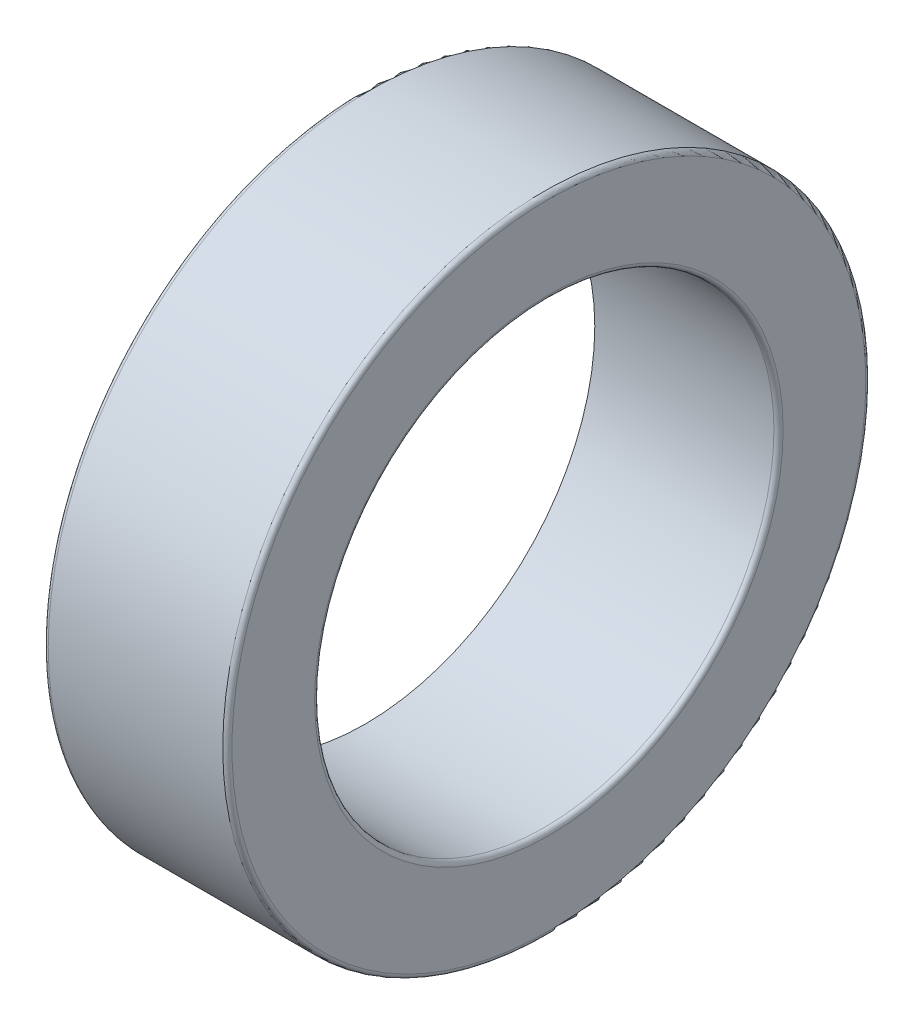
ISO-10303-21;
HEADER;
FILE_DESCRIPTION(('STEP AP214'),'2;1');
FILE_NAME('part.step','',(''),(''),'','','');
FILE_SCHEMA(('AUTOMOTIVE_DESIGN { 1 0 10303 214 1 1 1 1 }'));
ENDSEC;
DATA;
#1=APPLICATION_CONTEXT('core data for automotive mechanical design processes');
#2=APPLICATION_PROTOCOL_DEFINITION('international standard','automotive_design',2000,#1);
#3=PRODUCT_CONTEXT('',#1,'mechanical');
#4=PRODUCT('Part','Part','',(#3));
#5=PRODUCT_RELATED_PRODUCT_CATEGORY('part','',(#4));
#6=PRODUCT_DEFINITION_FORMATION('','',#4);
#7=PRODUCT_DEFINITION_CONTEXT('part definition',#1,'design');
#8=PRODUCT_DEFINITION('design','',#6,#7);
#9=PRODUCT_DEFINITION_SHAPE('','',#8);
#10=(LENGTH_UNIT() NAMED_UNIT(*) SI_UNIT(.MILLI.,.METRE.));
#11=(NAMED_UNIT(*) PLANE_ANGLE_UNIT() SI_UNIT($,.RADIAN.));
#12=(NAMED_UNIT(*) SI_UNIT($,.STERADIAN.) SOLID_ANGLE_UNIT());
#13=UNCERTAINTY_MEASURE_WITH_UNIT(LENGTH_MEASURE(1.E-05),#10,'distance_accuracy_value','');
#14=(GEOMETRIC_REPRESENTATION_CONTEXT(3) GLOBAL_UNCERTAINTY_ASSIGNED_CONTEXT((#13)) GLOBAL_UNIT_ASSIGNED_CONTEXT((#10,
#11,#12)) REPRESENTATION_CONTEXT('',''));
#15=CARTESIAN_POINT('',(0.,0.,0.));
#16=DIRECTION('',(0.,0.,1.));
#17=DIRECTION('',(1.,0.,0.));
#18=AXIS2_PLACEMENT_3D('',#15,#16,#17);
#19=CARTESIAN_POINT('',(25.4,0.,0.));
#20=DIRECTION('',(1.,0.,0.));
#21=DIRECTION('',(0.,0.,-1.));
#22=AXIS2_PLACEMENT_3D('',#19,#20,#21);
#23=PLANE('',#22);
#24=CARTESIAN_POINT('',(25.4,0.,0.));
#25=DIRECTION('',(1.,0.,0.));
#26=DIRECTION('',(0.,0.,-1.));
#27=AXIS2_PLACEMENT_3D('',#24,#25,#26);
#28=CIRCLE('',#27,64.77);
#29=CARTESIAN_POINT('',(25.4,0.,-64.77));
#30=VERTEX_POINT('',#29);
#31=EDGE_CURVE('E50',#30,#30,#28,.F.);
#32=ORIENTED_EDGE('',*,*,#31,.T.);
#33=EDGE_LOOP('',(#32));
#34=FACE_BOUND('',#33,.T.);
#35=CARTESIAN_POINT('',(25.4,0.,0.));
#36=DIRECTION('',(1.,0.,0.));
#37=DIRECTION('',(0.,0.,-1.));
#38=AXIS2_PLACEMENT_3D('',#35,#36,#37);
#39=CIRCLE('',#38,87.63);
#40=CARTESIAN_POINT('',(25.4,0.,-87.63));
#41=VERTEX_POINT('',#40);
#42=EDGE_CURVE('E55',#41,#41,#39,.T.);
#43=ORIENTED_EDGE('',*,*,#42,.T.);
#44=EDGE_LOOP('',(#43));
#45=FACE_BOUND('',#44,.T.);
#46=ADVANCED_FACE('F35',(#34,#45),#23,.T.);
#47=CARTESIAN_POINT('',(-25.4,0.,0.));
#48=DIRECTION('',(1.,0.,0.));
#49=DIRECTION('',(0.,0.,-1.));
#50=AXIS2_PLACEMENT_3D('',#47,#48,#49);
#51=PLANE('',#50);
#52=CARTESIAN_POINT('',(-25.4,0.,0.));
#53=DIRECTION('',(1.,0.,0.));
#54=DIRECTION('',(0.,0.,-1.));
#55=AXIS2_PLACEMENT_3D('',#52,#53,#54);
#56=CIRCLE('',#55,87.63);
#57=CARTESIAN_POINT('',(-25.4,0.,-87.63));
#58=VERTEX_POINT('',#57);
#59=EDGE_CURVE('E10',#58,#58,#56,.F.);
#60=ORIENTED_EDGE('',*,*,#59,.T.);
#61=EDGE_LOOP('',(#60));
#62=FACE_BOUND('',#61,.T.);
#63=CARTESIAN_POINT('',(-25.4,0.,0.));
#64=DIRECTION('',(1.,0.,0.));
#65=DIRECTION('',(0.,0.,-1.));
#66=AXIS2_PLACEMENT_3D('',#63,#64,#65);
#67=CIRCLE('',#66,63.5);
#68=CARTESIAN_POINT('',(-25.4,0.,-63.5));
#69=VERTEX_POINT('',#68);
#70=EDGE_CURVE('E61',#69,#69,#67,.T.);
#71=ORIENTED_EDGE('',*,*,#70,.T.);
#72=EDGE_LOOP('',(#71));
#73=FACE_BOUND('',#72,.T.);
#74=ADVANCED_FACE('F65',(#62,#73),#51,.F.);
#75=CARTESIAN_POINT('',(25.4,0.,0.));
#76=DIRECTION('',(-1.,0.,0.));
#77=DIRECTION('',(0.,0.,1.));
#78=AXIS2_PLACEMENT_3D('',#75,#76,#77);
#79=CYLINDRICAL_SURFACE('',#78,88.9);
#80=CARTESIAN_POINT('',(24.13,0.,0.));
#81=DIRECTION('',(1.,0.,0.));
#82=DIRECTION('',(0.,0.,-1.));
#83=AXIS2_PLACEMENT_3D('',#80,#81,#82);
#84=CIRCLE('',#83,88.9);
#85=CARTESIAN_POINT('',(24.13,0.,-88.9));
#86=VERTEX_POINT('',#85);
#87=EDGE_CURVE('E42',#86,#86,#84,.F.);
#88=ORIENTED_EDGE('',*,*,#87,.T.);
#89=EDGE_LOOP('',(#88));
#90=FACE_BOUND('',#89,.T.);
#91=CARTESIAN_POINT('',(-24.13,0.,0.));
#92=DIRECTION('',(1.,0.,0.));
#93=DIRECTION('',(0.,0.,-1.));
#94=AXIS2_PLACEMENT_3D('',#91,#92,#93);
#95=CIRCLE('',#94,88.9);
#96=CARTESIAN_POINT('',(-24.13,0.,-88.9));
#97=VERTEX_POINT('',#96);
#98=EDGE_CURVE('E46',#97,#97,#95,.T.);
#99=ORIENTED_EDGE('',*,*,#98,.T.);
#100=EDGE_LOOP('',(#99));
#101=FACE_BOUND('',#100,.T.);
#102=ADVANCED_FACE('F70',(#90,#101),#79,.T.);
#103=CARTESIAN_POINT('',(25.4,0.,0.));
#104=DIRECTION('',(-1.,0.,0.));
#105=DIRECTION('',(0.,0.,1.));
#106=AXIS2_PLACEMENT_3D('',#103,#104,#105);
#107=CYLINDRICAL_SURFACE('',#106,63.5);
#108=CARTESIAN_POINT('',(24.13,0.,0.));
#109=DIRECTION('',(1.,0.,0.));
#110=DIRECTION('',(0.,0.,-1.));
#111=AXIS2_PLACEMENT_3D('',#108,#109,#110);
#112=CIRCLE('',#111,63.5);
#113=CARTESIAN_POINT('',(24.13,0.,-63.5));
#114=VERTEX_POINT('',#113);
#115=EDGE_CURVE('E58',#114,#114,#112,.T.);
#116=ORIENTED_EDGE('',*,*,#115,.T.);
#117=EDGE_LOOP('',(#116));
#118=FACE_BOUND('',#117,.T.);
#119=ORIENTED_EDGE('',*,*,#70,.F.);
#120=EDGE_LOOP('',(#119));
#121=FACE_BOUND('',#120,.T.);
#122=ADVANCED_FACE('F67',(#118,#121),#107,.F.);
#123=CARTESIAN_POINT('',(24.13,0.,0.));
#124=DIRECTION('',(1.,0.,0.));
#125=DIRECTION('',(0.,0.,-1.));
#126=AXIS2_PLACEMENT_3D('',#123,#124,#125);
#127=TOROIDAL_SURFACE('',#126,64.77,1.27);
#128=ORIENTED_EDGE('',*,*,#31,.F.);
#129=EDGE_LOOP('',(#128));
#130=FACE_BOUND('',#129,.T.);
#131=ORIENTED_EDGE('',*,*,#115,.F.);
#132=EDGE_LOOP('',(#131));
#133=FACE_BOUND('',#132,.T.);
#134=ADVANCED_FACE('F69',(#130,#133),#127,.T.);
#135=CARTESIAN_POINT('',(24.13,0.,0.));
#136=DIRECTION('',(1.,0.,0.));
#137=DIRECTION('',(0.,0.,-1.));
#138=AXIS2_PLACEMENT_3D('',#135,#136,#137);
#139=TOROIDAL_SURFACE('',#138,87.63,1.27);
#140=ORIENTED_EDGE('',*,*,#87,.F.);
#141=EDGE_LOOP('',(#140));
#142=FACE_BOUND('',#141,.T.);
#143=ORIENTED_EDGE('',*,*,#42,.F.);
#144=EDGE_LOOP('',(#143));
#145=FACE_BOUND('',#144,.T.);
#146=ADVANCED_FACE('F77',(#142,#145),#139,.T.);
#147=CARTESIAN_POINT('',(-24.13,0.,0.));
#148=DIRECTION('',(1.,0.,0.));
#149=DIRECTION('',(0.,0.,-1.));
#150=AXIS2_PLACEMENT_3D('',#147,#148,#149);
#151=TOROIDAL_SURFACE('',#150,87.63,1.27);
#152=ORIENTED_EDGE('',*,*,#59,.F.);
#153=EDGE_LOOP('',(#152));
#154=FACE_BOUND('',#153,.T.);
#155=ORIENTED_EDGE('',*,*,#98,.F.);
#156=EDGE_LOOP('',(#155));
#157=FACE_BOUND('',#156,.T.);
#158=ADVANCED_FACE('F37',(#154,#157),#151,.T.);
#159=CLOSED_SHELL('',(#46,#74,#102,#122,#134,#146,#158));
#160=MANIFOLD_SOLID_BREP('B2',#159);
#161=ADVANCED_BREP_SHAPE_REPRESENTATION('',(#18,#160),#14);
#162=SHAPE_DEFINITION_REPRESENTATION(#9,#161);
ENDSEC;
END-ISO-10303-21;
